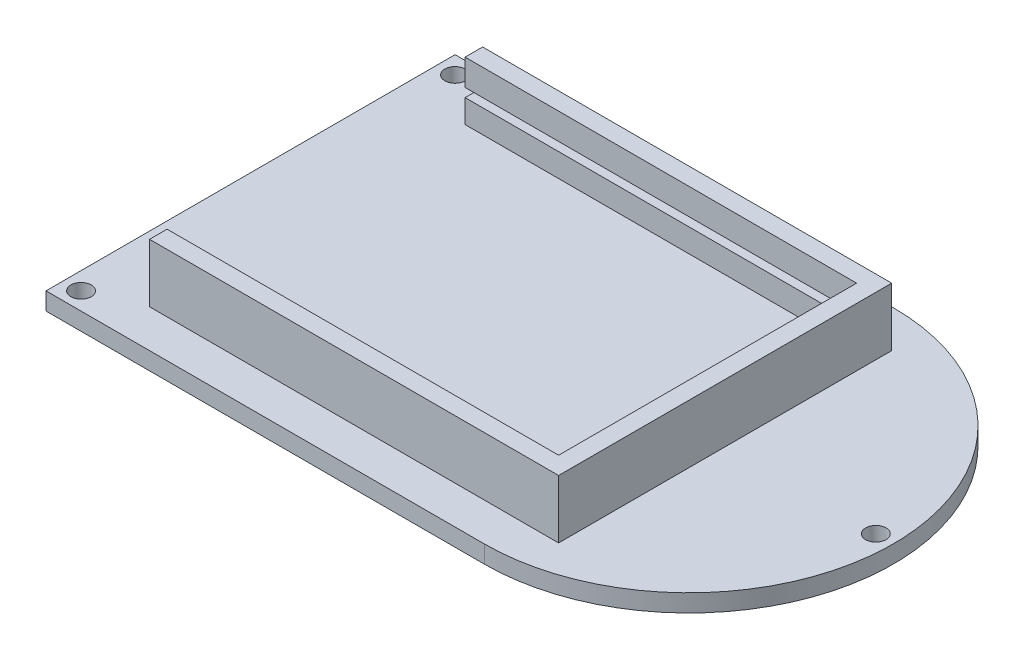
ISO-10303-21;
HEADER;
FILE_DESCRIPTION(('STEP AP214'),'2;1');
FILE_NAME('part.step','',(''),(''),'','','');
FILE_SCHEMA(('AUTOMOTIVE_DESIGN { 1 0 10303 214 1 1 1 1 }'));
ENDSEC;
DATA;
#1=APPLICATION_CONTEXT('core data for automotive mechanical design processes');
#2=APPLICATION_PROTOCOL_DEFINITION('international standard','automotive_design',2000,#1);
#3=PRODUCT_CONTEXT('',#1,'mechanical');
#4=PRODUCT('Part','Part','',(#3));
#5=PRODUCT_RELATED_PRODUCT_CATEGORY('part','',(#4));
#6=PRODUCT_DEFINITION_FORMATION('','',#4);
#7=PRODUCT_DEFINITION_CONTEXT('part definition',#1,'design');
#8=PRODUCT_DEFINITION('design','',#6,#7);
#9=PRODUCT_DEFINITION_SHAPE('','',#8);
#10=(LENGTH_UNIT() NAMED_UNIT(*) SI_UNIT(.MILLI.,.METRE.));
#11=(NAMED_UNIT(*) PLANE_ANGLE_UNIT() SI_UNIT($,.RADIAN.));
#12=(NAMED_UNIT(*) SI_UNIT($,.STERADIAN.) SOLID_ANGLE_UNIT());
#13=UNCERTAINTY_MEASURE_WITH_UNIT(LENGTH_MEASURE(1.E-05),#10,'distance_accuracy_value','');
#14=(GEOMETRIC_REPRESENTATION_CONTEXT(3) GLOBAL_UNCERTAINTY_ASSIGNED_CONTEXT((#13)) GLOBAL_UNIT_ASSIGNED_CONTEXT((#10,
#11,#12)) REPRESENTATION_CONTEXT('',''));
#15=CARTESIAN_POINT('',(0.,0.,0.));
#16=DIRECTION('',(0.,0.,1.));
#17=DIRECTION('',(1.,0.,0.));
#18=AXIS2_PLACEMENT_3D('',#15,#16,#17);
#19=CARTESIAN_POINT('',(-63.779471429519,13.,-25.5));
#20=DIRECTION('',(0.,0.,-1.));
#21=DIRECTION('',(-1.,0.,0.));
#22=AXIS2_PLACEMENT_3D('',#19,#20,#21);
#23=PLANE('',#22);
#24=DIRECTION('',(1.,0.,0.));
#25=VECTOR('',#24,1.);
#26=CARTESIAN_POINT('',(-63.779471429519,7.,-25.5));
#27=LINE('',#26,#25);
#28=CARTESIAN_POINT('',(-63.779471429519,7.,-25.5));
#29=VERTEX_POINT('',#28);
#30=CARTESIAN_POINT('',(3.22052857048104,7.,-25.5));
#31=VERTEX_POINT('',#30);
#32=EDGE_CURVE('E205',#29,#31,#27,.T.);
#33=ORIENTED_EDGE('',*,*,#32,.F.);
#34=DIRECTION('',(0.,-1.,0.));
#35=VECTOR('',#34,1.);
#36=CARTESIAN_POINT('',(-63.779471429519,13.,-25.5));
#37=LINE('',#36,#35);
#38=CARTESIAN_POINT('',(-63.779471429519,3.,-25.5));
#39=VERTEX_POINT('',#38);
#40=EDGE_CURVE('E269',#29,#39,#37,.T.);
#41=ORIENTED_EDGE('',*,*,#40,.T.);
#42=DIRECTION('',(1.,0.,0.));
#43=VECTOR('',#42,1.);
#44=CARTESIAN_POINT('',(-63.779471429519,3.,-25.5));
#45=LINE('',#44,#43);
#46=CARTESIAN_POINT('',(3.22052857048104,3.,-25.5));
#47=VERTEX_POINT('',#46);
#48=EDGE_CURVE('E253',#39,#47,#45,.T.);
#49=ORIENTED_EDGE('',*,*,#48,.T.);
#50=DIRECTION('',(0.,-1.,0.));
#51=VECTOR('',#50,1.);
#52=CARTESIAN_POINT('',(3.22052857048104,13.,-25.5));
#53=LINE('',#52,#51);
#54=EDGE_CURVE('E265',#31,#47,#53,.T.);
#55=ORIENTED_EDGE('',*,*,#54,.F.);
#56=EDGE_LOOP('',(#33,#41,#49,#55));
#57=FACE_BOUND('',#56,.T.);
#58=ADVANCED_FACE('F34',(#57),#23,.F.);
#59=CARTESIAN_POINT('',(3.22052857048104,13.,-25.5));
#60=DIRECTION('',(1.,0.,0.));
#61=DIRECTION('',(0.,0.,-1.));
#62=AXIS2_PLACEMENT_3D('',#59,#60,#61);
#63=PLANE('',#62);
#64=DIRECTION('',(0.,0.,1.));
#65=VECTOR('',#64,1.);
#66=CARTESIAN_POINT('',(3.22052857048104,7.,-25.5));
#67=LINE('',#66,#65);
#68=CARTESIAN_POINT('',(3.22052857048104,7.,25.5));
#69=VERTEX_POINT('',#68);
#70=EDGE_CURVE('E49',#31,#69,#67,.T.);
#71=ORIENTED_EDGE('',*,*,#70,.F.);
#72=ORIENTED_EDGE('',*,*,#54,.T.);
#73=DIRECTION('',(0.,0.,1.));
#74=VECTOR('',#73,1.);
#75=CARTESIAN_POINT('',(3.22052857048104,3.,-25.5));
#76=LINE('',#75,#74);
#77=CARTESIAN_POINT('',(3.22052857048104,3.,25.5));
#78=VERTEX_POINT('',#77);
#79=EDGE_CURVE('E256',#47,#78,#76,.T.);
#80=ORIENTED_EDGE('',*,*,#79,.T.);
#81=DIRECTION('',(0.,-1.,0.));
#82=VECTOR('',#81,1.);
#83=CARTESIAN_POINT('',(3.22052857048104,13.,25.5));
#84=LINE('',#83,#82);
#85=EDGE_CURVE('E56',#69,#78,#84,.T.);
#86=ORIENTED_EDGE('',*,*,#85,.F.);
#87=EDGE_LOOP('',(#71,#72,#80,#86));
#88=FACE_BOUND('',#87,.T.);
#89=ADVANCED_FACE('F352',(#88),#63,.F.);
#90=CARTESIAN_POINT('',(-63.779471429519,13.,25.5));
#91=DIRECTION('',(0.,0.,1.));
#92=DIRECTION('',(1.,0.,0.));
#93=AXIS2_PLACEMENT_3D('',#90,#91,#92);
#94=PLANE('',#93);
#95=DIRECTION('',(-1.,0.,0.));
#96=VECTOR('',#95,1.);
#97=CARTESIAN_POINT('',(-63.779471429519,7.,25.5));
#98=LINE('',#97,#96);
#99=CARTESIAN_POINT('',(-63.779471429519,7.,25.5));
#100=VERTEX_POINT('',#99);
#101=EDGE_CURVE('E332',#69,#100,#98,.T.);
#102=ORIENTED_EDGE('',*,*,#101,.F.);
#103=ORIENTED_EDGE('',*,*,#85,.T.);
#104=DIRECTION('',(-1.,0.,0.));
#105=VECTOR('',#104,1.);
#106=CARTESIAN_POINT('',(-63.779471429519,3.,25.5));
#107=LINE('',#106,#105);
#108=CARTESIAN_POINT('',(-63.779471429519,3.,25.5));
#109=VERTEX_POINT('',#108);
#110=EDGE_CURVE('E227',#78,#109,#107,.T.);
#111=ORIENTED_EDGE('',*,*,#110,.T.);
#112=DIRECTION('',(0.,-1.,0.));
#113=VECTOR('',#112,1.);
#114=CARTESIAN_POINT('',(-63.779471429519,13.,25.5));
#115=LINE('',#114,#113);
#116=EDGE_CURVE('E241',#100,#109,#115,.T.);
#117=ORIENTED_EDGE('',*,*,#116,.F.);
#118=EDGE_LOOP('',(#102,#103,#111,#117));
#119=FACE_BOUND('',#118,.T.);
#120=ADVANCED_FACE('F359',(#119),#94,.F.);
#121=CARTESIAN_POINT('',(0.,3.,0.));
#122=DIRECTION('',(0.,1.,0.));
#123=DIRECTION('',(0.,0.,1.));
#124=AXIS2_PLACEMENT_3D('',#121,#122,#123);
#125=PLANE('',#124);
#126=CARTESIAN_POINT('',(-72.,3.,32.));
#127=DIRECTION('',(0.,1.,0.));
#128=DIRECTION('',(0.,0.,1.));
#129=AXIS2_PLACEMENT_3D('',#126,#127,#128);
#130=CIRCLE('',#129,1.75);
#131=CARTESIAN_POINT('',(-72.,3.,33.75));
#132=VERTEX_POINT('',#131);
#133=EDGE_CURVE('E291',#132,#132,#130,.T.);
#134=ORIENTED_EDGE('',*,*,#133,.F.);
#135=EDGE_LOOP('',(#134));
#136=FACE_BOUND('',#135,.T.);
#137=CARTESIAN_POINT('',(0.,3.,0.));
#138=DIRECTION('',(0.,1.,0.));
#139=DIRECTION('',(0.,0.,1.));
#140=AXIS2_PLACEMENT_3D('',#137,#138,#139);
#141=CIRCLE('',#140,35.);
#142=CARTESIAN_POINT('',(0.,3.,35.));
#143=VERTEX_POINT('',#142);
#144=CARTESIAN_POINT('',(0.,3.,-35.));
#145=VERTEX_POINT('',#144);
#146=EDGE_CURVE('E303',#143,#145,#141,.T.);
#147=ORIENTED_EDGE('',*,*,#146,.T.);
#148=DIRECTION('',(-1.,0.,0.));
#149=VECTOR('',#148,1.);
#150=CARTESIAN_POINT('',(0.,3.,-35.));
#151=LINE('',#150,#149);
#152=CARTESIAN_POINT('',(-75.,3.,-35.));
#153=VERTEX_POINT('',#152);
#154=EDGE_CURVE('E306',#145,#153,#151,.T.);
#155=ORIENTED_EDGE('',*,*,#154,.T.);
#156=DIRECTION('',(0.,0.,1.));
#157=VECTOR('',#156,1.);
#158=CARTESIAN_POINT('',(-75.,3.,-35.));
#159=LINE('',#158,#157);
#160=CARTESIAN_POINT('',(-75.,3.,35.));
#161=VERTEX_POINT('',#160);
#162=EDGE_CURVE('E309',#153,#161,#159,.T.);
#163=ORIENTED_EDGE('',*,*,#162,.T.);
#164=DIRECTION('',(1.,0.,0.));
#165=VECTOR('',#164,1.);
#166=CARTESIAN_POINT('',(0.,3.,35.));
#167=LINE('',#166,#165);
#168=EDGE_CURVE('E311',#161,#143,#167,.T.);
#169=ORIENTED_EDGE('',*,*,#168,.T.);
#170=EDGE_LOOP('',(#147,#155,#163,#169));
#171=FACE_BOUND('',#170,.T.);
#172=CARTESIAN_POINT('',(-72.,3.,-32.));
#173=DIRECTION('',(0.,1.,0.));
#174=DIRECTION('',(0.,0.,1.));
#175=AXIS2_PLACEMENT_3D('',#172,#173,#174);
#176=CIRCLE('',#175,1.75);
#177=CARTESIAN_POINT('',(-72.,3.,-30.25));
#178=VERTEX_POINT('',#177);
#179=EDGE_CURVE('E297',#178,#178,#176,.T.);
#180=ORIENTED_EDGE('',*,*,#179,.F.);
#181=EDGE_LOOP('',(#180));
#182=FACE_BOUND('',#181,.T.);
#183=CARTESIAN_POINT('',(32.,3.,0.));
#184=DIRECTION('',(0.,1.,0.));
#185=DIRECTION('',(0.,0.,1.));
#186=AXIS2_PLACEMENT_3D('',#183,#184,#185);
#187=CIRCLE('',#186,1.75);
#188=CARTESIAN_POINT('',(32.,3.,1.75));
#189=VERTEX_POINT('',#188);
#190=EDGE_CURVE('E285',#189,#189,#187,.T.);
#191=ORIENTED_EDGE('',*,*,#190,.F.);
#192=EDGE_LOOP('',(#191));
#193=FACE_BOUND('',#192,.T.);
#194=DIRECTION('',(1.,0.,0.));
#195=VECTOR('',#194,1.);
#196=CARTESIAN_POINT('',(6.22052857048104,3.,28.5));
#197=LINE('',#196,#195);
#198=CARTESIAN_POINT('',(-63.779471429519,3.,28.5));
#199=VERTEX_POINT('',#198);
#200=CARTESIAN_POINT('',(6.22052857048104,3.,28.5));
#201=VERTEX_POINT('',#200);
#202=EDGE_CURVE('E244',#199,#201,#197,.T.);
#203=ORIENTED_EDGE('',*,*,#202,.F.);
#204=DIRECTION('',(0.,0.,1.));
#205=VECTOR('',#204,1.);
#206=CARTESIAN_POINT('',(-63.779471429519,3.,25.5));
#207=LINE('',#206,#205);
#208=EDGE_CURVE('E222',#109,#199,#207,.T.);
#209=ORIENTED_EDGE('',*,*,#208,.F.);
#210=ORIENTED_EDGE('',*,*,#110,.F.);
#211=ORIENTED_EDGE('',*,*,#79,.F.);
#212=ORIENTED_EDGE('',*,*,#48,.F.);
#213=DIRECTION('',(0.,0.,1.));
#214=VECTOR('',#213,1.);
#215=CARTESIAN_POINT('',(-63.779471429519,3.,-28.5));
#216=LINE('',#215,#214);
#217=CARTESIAN_POINT('',(-63.779471429519,3.,-28.5));
#218=VERTEX_POINT('',#217);
#219=EDGE_CURVE('E250',#218,#39,#216,.T.);
#220=ORIENTED_EDGE('',*,*,#219,.F.);
#221=DIRECTION('',(-1.,0.,0.));
#222=VECTOR('',#221,1.);
#223=CARTESIAN_POINT('',(6.22052857048103,3.,-28.5));
#224=LINE('',#223,#222);
#225=CARTESIAN_POINT('',(6.22052857048103,3.,-28.5));
#226=VERTEX_POINT('',#225);
#227=EDGE_CURVE('E248',#226,#218,#224,.T.);
#228=ORIENTED_EDGE('',*,*,#227,.F.);
#229=DIRECTION('',(0.,0.,-1.));
#230=VECTOR('',#229,1.);
#231=CARTESIAN_POINT('',(6.22052857048103,3.,-28.5));
#232=LINE('',#231,#230);
#233=EDGE_CURVE('E246',#201,#226,#232,.T.);
#234=ORIENTED_EDGE('',*,*,#233,.F.);
#235=EDGE_LOOP('',(#203,#209,#210,#211,#212,#220,#228,#234));
#236=FACE_BOUND('',#235,.T.);
#237=ADVANCED_FACE('F357',(#136,#171,#182,#193,#236),#125,.T.);
#238=CARTESIAN_POINT('',(0.,0.,0.));
#239=DIRECTION('',(0.,1.,0.));
#240=DIRECTION('',(0.,0.,1.));
#241=AXIS2_PLACEMENT_3D('',#238,#239,#240);
#242=PLANE('',#241);
#243=CARTESIAN_POINT('',(0.,0.,0.));
#244=DIRECTION('',(0.,1.,0.));
#245=DIRECTION('',(0.,0.,1.));
#246=AXIS2_PLACEMENT_3D('',#243,#244,#245);
#247=CIRCLE('',#246,35.);
#248=CARTESIAN_POINT('',(0.,0.,35.));
#249=VERTEX_POINT('',#248);
#250=CARTESIAN_POINT('',(0.,0.,-35.));
#251=VERTEX_POINT('',#250);
#252=EDGE_CURVE('E300',#249,#251,#247,.T.);
#253=ORIENTED_EDGE('',*,*,#252,.F.);
#254=DIRECTION('',(1.,0.,0.));
#255=VECTOR('',#254,1.);
#256=CARTESIAN_POINT('',(0.,0.,35.));
#257=LINE('',#256,#255);
#258=CARTESIAN_POINT('',(-75.,0.,35.));
#259=VERTEX_POINT('',#258);
#260=EDGE_CURVE('E307',#259,#249,#257,.T.);
#261=ORIENTED_EDGE('',*,*,#260,.F.);
#262=DIRECTION('',(0.,0.,1.));
#263=VECTOR('',#262,1.);
#264=CARTESIAN_POINT('',(-75.,0.,-35.));
#265=LINE('',#264,#263);
#266=CARTESIAN_POINT('',(-75.,0.,-35.));
#267=VERTEX_POINT('',#266);
#268=EDGE_CURVE('E318',#267,#259,#265,.T.);
#269=ORIENTED_EDGE('',*,*,#268,.F.);
#270=DIRECTION('',(-1.,0.,0.));
#271=VECTOR('',#270,1.);
#272=CARTESIAN_POINT('',(0.,0.,-35.));
#273=LINE('',#272,#271);
#274=EDGE_CURVE('E316',#251,#267,#273,.T.);
#275=ORIENTED_EDGE('',*,*,#274,.F.);
#276=EDGE_LOOP('',(#253,#261,#269,#275));
#277=FACE_BOUND('',#276,.T.);
#278=CARTESIAN_POINT('',(-72.,0.,-32.));
#279=DIRECTION('',(0.,1.,0.));
#280=DIRECTION('',(0.,0.,1.));
#281=AXIS2_PLACEMENT_3D('',#278,#279,#280);
#282=CIRCLE('',#281,1.75);
#283=CARTESIAN_POINT('',(-72.,0.,-30.25));
#284=VERTEX_POINT('',#283);
#285=EDGE_CURVE('E294',#284,#284,#282,.T.);
#286=ORIENTED_EDGE('',*,*,#285,.T.);
#287=EDGE_LOOP('',(#286));
#288=FACE_BOUND('',#287,.T.);
#289=CARTESIAN_POINT('',(-72.,0.,32.));
#290=DIRECTION('',(0.,1.,0.));
#291=DIRECTION('',(0.,0.,1.));
#292=AXIS2_PLACEMENT_3D('',#289,#290,#291);
#293=CIRCLE('',#292,1.75);
#294=CARTESIAN_POINT('',(-72.,0.,33.75));
#295=VERTEX_POINT('',#294);
#296=EDGE_CURVE('E288',#295,#295,#293,.T.);
#297=ORIENTED_EDGE('',*,*,#296,.T.);
#298=EDGE_LOOP('',(#297));
#299=FACE_BOUND('',#298,.T.);
#300=CARTESIAN_POINT('',(32.,0.,0.));
#301=DIRECTION('',(0.,1.,0.));
#302=DIRECTION('',(0.,0.,1.));
#303=AXIS2_PLACEMENT_3D('',#300,#301,#302);
#304=CIRCLE('',#303,1.75);
#305=CARTESIAN_POINT('',(32.,0.,1.75));
#306=VERTEX_POINT('',#305);
#307=EDGE_CURVE('E284',#306,#306,#304,.T.);
#308=ORIENTED_EDGE('',*,*,#307,.T.);
#309=EDGE_LOOP('',(#308));
#310=FACE_BOUND('',#309,.T.);
#311=ADVANCED_FACE('F440',(#277,#288,#299,#310),#242,.F.);
#312=CARTESIAN_POINT('',(0.,3.,0.));
#313=DIRECTION('',(0.,-1.,0.));
#314=DIRECTION('',(0.,0.,-1.));
#315=AXIS2_PLACEMENT_3D('',#312,#313,#314);
#316=CYLINDRICAL_SURFACE('',#315,35.);
#317=ORIENTED_EDGE('',*,*,#252,.T.);
#318=DIRECTION('',(0.,-1.,0.));
#319=VECTOR('',#318,1.);
#320=CARTESIAN_POINT('',(0.,3.,-35.));
#321=LINE('',#320,#319);
#322=EDGE_CURVE('E329',#145,#251,#321,.T.);
#323=ORIENTED_EDGE('',*,*,#322,.F.);
#324=ORIENTED_EDGE('',*,*,#146,.F.);
#325=DIRECTION('',(0.,-1.,0.));
#326=VECTOR('',#325,1.);
#327=CARTESIAN_POINT('',(0.,3.,35.));
#328=LINE('',#327,#326);
#329=EDGE_CURVE('E313',#143,#249,#328,.T.);
#330=ORIENTED_EDGE('',*,*,#329,.T.);
#331=EDGE_LOOP('',(#317,#323,#324,#330));
#332=FACE_BOUND('',#331,.T.);
#333=ADVANCED_FACE('F36',(#332),#316,.T.);
#334=CARTESIAN_POINT('',(0.,3.,-35.));
#335=DIRECTION('',(0.,0.,1.));
#336=DIRECTION('',(1.,0.,0.));
#337=AXIS2_PLACEMENT_3D('',#334,#335,#336);
#338=PLANE('',#337);
#339=ORIENTED_EDGE('',*,*,#274,.T.);
#340=DIRECTION('',(0.,-1.,0.));
#341=VECTOR('',#340,1.);
#342=CARTESIAN_POINT('',(-75.,3.,-35.));
#343=LINE('',#342,#341);
#344=EDGE_CURVE('E326',#153,#267,#343,.T.);
#345=ORIENTED_EDGE('',*,*,#344,.F.);
#346=ORIENTED_EDGE('',*,*,#154,.F.);
#347=ORIENTED_EDGE('',*,*,#322,.T.);
#348=EDGE_LOOP('',(#339,#345,#346,#347));
#349=FACE_BOUND('',#348,.T.);
#350=ADVANCED_FACE('F492',(#349),#338,.F.);
#351=CARTESIAN_POINT('',(-75.,3.,-35.));
#352=DIRECTION('',(1.,0.,0.));
#353=DIRECTION('',(0.,0.,-1.));
#354=AXIS2_PLACEMENT_3D('',#351,#352,#353);
#355=PLANE('',#354);
#356=ORIENTED_EDGE('',*,*,#268,.T.);
#357=DIRECTION('',(0.,-1.,0.));
#358=VECTOR('',#357,1.);
#359=CARTESIAN_POINT('',(-75.,3.,35.));
#360=LINE('',#359,#358);
#361=EDGE_CURVE('E323',#161,#259,#360,.T.);
#362=ORIENTED_EDGE('',*,*,#361,.F.);
#363=ORIENTED_EDGE('',*,*,#162,.F.);
#364=ORIENTED_EDGE('',*,*,#344,.T.);
#365=EDGE_LOOP('',(#356,#362,#363,#364));
#366=FACE_BOUND('',#365,.T.);
#367=ADVANCED_FACE('F482',(#366),#355,.F.);
#368=CARTESIAN_POINT('',(0.,3.,35.));
#369=DIRECTION('',(0.,0.,-1.));
#370=DIRECTION('',(-1.,0.,0.));
#371=AXIS2_PLACEMENT_3D('',#368,#369,#370);
#372=PLANE('',#371);
#373=ORIENTED_EDGE('',*,*,#260,.T.);
#374=ORIENTED_EDGE('',*,*,#329,.F.);
#375=ORIENTED_EDGE('',*,*,#168,.F.);
#376=ORIENTED_EDGE('',*,*,#361,.T.);
#377=EDGE_LOOP('',(#373,#374,#375,#376));
#378=FACE_BOUND('',#377,.T.);
#379=ADVANCED_FACE('F472',(#378),#372,.F.);
#380=CARTESIAN_POINT('',(-72.,3.,-32.));
#381=DIRECTION('',(0.,-1.,0.));
#382=DIRECTION('',(0.,0.,-1.));
#383=AXIS2_PLACEMENT_3D('',#380,#381,#382);
#384=CYLINDRICAL_SURFACE('',#383,1.75);
#385=ORIENTED_EDGE('',*,*,#179,.T.);
#386=EDGE_LOOP('',(#385));
#387=FACE_BOUND('',#386,.T.);
#388=ORIENTED_EDGE('',*,*,#285,.F.);
#389=EDGE_LOOP('',(#388));
#390=FACE_BOUND('',#389,.T.);
#391=ADVANCED_FACE('F462',(#387,#390),#384,.F.);
#392=CARTESIAN_POINT('',(-72.,3.,32.));
#393=DIRECTION('',(0.,-1.,0.));
#394=DIRECTION('',(0.,0.,-1.));
#395=AXIS2_PLACEMENT_3D('',#392,#393,#394);
#396=CYLINDRICAL_SURFACE('',#395,1.75);
#397=ORIENTED_EDGE('',*,*,#133,.T.);
#398=EDGE_LOOP('',(#397));
#399=FACE_BOUND('',#398,.T.);
#400=ORIENTED_EDGE('',*,*,#296,.F.);
#401=EDGE_LOOP('',(#400));
#402=FACE_BOUND('',#401,.T.);
#403=ADVANCED_FACE('F452',(#399,#402),#396,.F.);
#404=CARTESIAN_POINT('',(32.,3.,0.));
#405=DIRECTION('',(0.,-1.,0.));
#406=DIRECTION('',(0.,0.,-1.));
#407=AXIS2_PLACEMENT_3D('',#404,#405,#406);
#408=CYLINDRICAL_SURFACE('',#407,1.75);
#409=ORIENTED_EDGE('',*,*,#190,.T.);
#410=EDGE_LOOP('',(#409));
#411=FACE_BOUND('',#410,.T.);
#412=ORIENTED_EDGE('',*,*,#307,.F.);
#413=EDGE_LOOP('',(#412));
#414=FACE_BOUND('',#413,.T.);
#415=ADVANCED_FACE('F401',(#411,#414),#408,.F.);
#416=CARTESIAN_POINT('',(-63.779471429519,13.,25.5));
#417=DIRECTION('',(1.,0.,0.));
#418=DIRECTION('',(0.,0.,-1.));
#419=AXIS2_PLACEMENT_3D('',#416,#417,#418);
#420=PLANE('',#419);
#421=CARTESIAN_POINT('',(-63.779471429519,13.,25.5));
#422=VERTEX_POINT('',#421);
#423=CARTESIAN_POINT('',(-63.779471429519,8.5,25.5));
#424=VERTEX_POINT('',#423);
#425=EDGE_CURVE('E259',#422,#424,#115,.T.);
#426=ORIENTED_EDGE('',*,*,#425,.T.);
#427=DIRECTION('',(0.,0.,1.));
#428=VECTOR('',#427,1.);
#429=CARTESIAN_POINT('',(-63.779471429519,8.5,25.5));
#430=LINE('',#429,#428);
#431=CARTESIAN_POINT('',(-63.779471429519,8.5,27.));
#432=VERTEX_POINT('',#431);
#433=EDGE_CURVE('E220',#424,#432,#430,.T.);
#434=ORIENTED_EDGE('',*,*,#433,.T.);
#435=DIRECTION('',(0.,1.,0.));
#436=VECTOR('',#435,1.);
#437=CARTESIAN_POINT('',(-63.779471429519,13.,27.));
#438=LINE('',#437,#436);
#439=CARTESIAN_POINT('',(-63.779471429519,7.,27.));
#440=VERTEX_POINT('',#439);
#441=EDGE_CURVE('E11',#440,#432,#438,.T.);
#442=ORIENTED_EDGE('',*,*,#441,.F.);
#443=DIRECTION('',(0.,0.,1.));
#444=VECTOR('',#443,1.);
#445=CARTESIAN_POINT('',(-63.779471429519,7.,25.5));
#446=LINE('',#445,#444);
#447=EDGE_CURVE('E209',#100,#440,#446,.T.);
#448=ORIENTED_EDGE('',*,*,#447,.F.);
#449=ORIENTED_EDGE('',*,*,#116,.T.);
#450=ORIENTED_EDGE('',*,*,#208,.T.);
#451=DIRECTION('',(0.,-1.,0.));
#452=VECTOR('',#451,1.);
#453=CARTESIAN_POINT('',(-63.779471429519,13.,28.5));
#454=LINE('',#453,#452);
#455=CARTESIAN_POINT('',(-63.779471429519,13.,28.5));
#456=VERTEX_POINT('',#455);
#457=EDGE_CURVE('E282',#456,#199,#454,.T.);
#458=ORIENTED_EDGE('',*,*,#457,.F.);
#459=DIRECTION('',(0.,0.,1.));
#460=VECTOR('',#459,1.);
#461=CARTESIAN_POINT('',(-63.779471429519,13.,25.5));
#462=LINE('',#461,#460);
#463=EDGE_CURVE('E223',#422,#456,#462,.T.);
#464=ORIENTED_EDGE('',*,*,#463,.F.);
#465=EDGE_LOOP('',(#426,#434,#442,#448,#449,#450,#458,#464));
#466=FACE_BOUND('',#465,.T.);
#467=ADVANCED_FACE('F362',(#466),#420,.F.);
#468=CARTESIAN_POINT('',(6.22052857048104,13.,28.5));
#469=DIRECTION('',(0.,0.,-1.));
#470=DIRECTION('',(-1.,0.,0.));
#471=AXIS2_PLACEMENT_3D('',#468,#469,#470);
#472=PLANE('',#471);
#473=ORIENTED_EDGE('',*,*,#202,.T.);
#474=DIRECTION('',(0.,-1.,0.));
#475=VECTOR('',#474,1.);
#476=CARTESIAN_POINT('',(6.22052857048104,13.,28.5));
#477=LINE('',#476,#475);
#478=CARTESIAN_POINT('',(6.22052857048104,13.,28.5));
#479=VERTEX_POINT('',#478);
#480=EDGE_CURVE('E279',#479,#201,#477,.T.);
#481=ORIENTED_EDGE('',*,*,#480,.F.);
#482=DIRECTION('',(1.,0.,0.));
#483=VECTOR('',#482,1.);
#484=CARTESIAN_POINT('',(6.22052857048104,13.,28.5));
#485=LINE('',#484,#483);
#486=EDGE_CURVE('E226',#456,#479,#485,.T.);
#487=ORIENTED_EDGE('',*,*,#486,.F.);
#488=ORIENTED_EDGE('',*,*,#457,.T.);
#489=EDGE_LOOP('',(#473,#481,#487,#488));
#490=FACE_BOUND('',#489,.T.);
#491=ADVANCED_FACE('F393',(#490),#472,.F.);
#492=CARTESIAN_POINT('',(6.22052857048103,13.,-28.5));
#493=DIRECTION('',(-1.,0.,0.));
#494=DIRECTION('',(0.,0.,1.));
#495=AXIS2_PLACEMENT_3D('',#492,#493,#494);
#496=PLANE('',#495);
#497=ORIENTED_EDGE('',*,*,#233,.T.);
#498=DIRECTION('',(0.,-1.,0.));
#499=VECTOR('',#498,1.);
#500=CARTESIAN_POINT('',(6.22052857048103,13.,-28.5));
#501=LINE('',#500,#499);
#502=CARTESIAN_POINT('',(6.22052857048103,13.,-28.5));
#503=VERTEX_POINT('',#502);
#504=EDGE_CURVE('E276',#503,#226,#501,.T.);
#505=ORIENTED_EDGE('',*,*,#504,.F.);
#506=DIRECTION('',(0.,0.,-1.));
#507=VECTOR('',#506,1.);
#508=CARTESIAN_POINT('',(6.22052857048103,13.,-28.5));
#509=LINE('',#508,#507);
#510=EDGE_CURVE('E229',#479,#503,#509,.T.);
#511=ORIENTED_EDGE('',*,*,#510,.F.);
#512=ORIENTED_EDGE('',*,*,#480,.T.);
#513=EDGE_LOOP('',(#497,#505,#511,#512));
#514=FACE_BOUND('',#513,.T.);
#515=ADVANCED_FACE('F390',(#514),#496,.F.);
#516=CARTESIAN_POINT('',(6.22052857048103,13.,-28.5));
#517=DIRECTION('',(0.,0.,1.));
#518=DIRECTION('',(1.,0.,0.));
#519=AXIS2_PLACEMENT_3D('',#516,#517,#518);
#520=PLANE('',#519);
#521=ORIENTED_EDGE('',*,*,#227,.T.);
#522=DIRECTION('',(0.,-1.,0.));
#523=VECTOR('',#522,1.);
#524=CARTESIAN_POINT('',(-63.779471429519,13.,-28.5));
#525=LINE('',#524,#523);
#526=CARTESIAN_POINT('',(-63.779471429519,13.,-28.5));
#527=VERTEX_POINT('',#526);
#528=EDGE_CURVE('E273',#527,#218,#525,.T.);
#529=ORIENTED_EDGE('',*,*,#528,.F.);
#530=DIRECTION('',(-1.,0.,0.));
#531=VECTOR('',#530,1.);
#532=CARTESIAN_POINT('',(6.22052857048103,13.,-28.5));
#533=LINE('',#532,#531);
#534=EDGE_CURVE('E231',#503,#527,#533,.T.);
#535=ORIENTED_EDGE('',*,*,#534,.F.);
#536=ORIENTED_EDGE('',*,*,#504,.T.);
#537=EDGE_LOOP('',(#521,#529,#535,#536));
#538=FACE_BOUND('',#537,.T.);
#539=ADVANCED_FACE('F386',(#538),#520,.F.);
#540=CARTESIAN_POINT('',(-63.779471429519,13.,-28.5));
#541=DIRECTION('',(1.,0.,0.));
#542=DIRECTION('',(0.,0.,-1.));
#543=AXIS2_PLACEMENT_3D('',#540,#541,#542);
#544=PLANE('',#543);
#545=DIRECTION('',(0.,-1.,0.));
#546=VECTOR('',#545,1.);
#547=CARTESIAN_POINT('',(-63.779471429519,13.,-27.));
#548=LINE('',#547,#546);
#549=CARTESIAN_POINT('',(-63.779471429519,8.5,-27.));
#550=VERTEX_POINT('',#549);
#551=CARTESIAN_POINT('',(-63.779471429519,7.,-27.));
#552=VERTEX_POINT('',#551);
#553=EDGE_CURVE('E42',#550,#552,#548,.T.);
#554=ORIENTED_EDGE('',*,*,#553,.F.);
#555=DIRECTION('',(0.,0.,1.));
#556=VECTOR('',#555,1.);
#557=CARTESIAN_POINT('',(-63.779471429519,8.5,-28.5));
#558=LINE('',#557,#556);
#559=CARTESIAN_POINT('',(-63.779471429519,8.5,-25.5));
#560=VERTEX_POINT('',#559);
#561=EDGE_CURVE('E217',#550,#560,#558,.T.);
#562=ORIENTED_EDGE('',*,*,#561,.T.);
#563=CARTESIAN_POINT('',(-63.779471429519,13.,-25.5));
#564=VERTEX_POINT('',#563);
#565=EDGE_CURVE('E270',#564,#560,#37,.T.);
#566=ORIENTED_EDGE('',*,*,#565,.F.);
#567=DIRECTION('',(0.,0.,1.));
#568=VECTOR('',#567,1.);
#569=CARTESIAN_POINT('',(-63.779471429519,13.,-28.5));
#570=LINE('',#569,#568);
#571=EDGE_CURVE('E233',#527,#564,#570,.T.);
#572=ORIENTED_EDGE('',*,*,#571,.F.);
#573=ORIENTED_EDGE('',*,*,#528,.T.);
#574=ORIENTED_EDGE('',*,*,#219,.T.);
#575=ORIENTED_EDGE('',*,*,#40,.F.);
#576=DIRECTION('',(0.,0.,1.));
#577=VECTOR('',#576,1.);
#578=CARTESIAN_POINT('',(-63.779471429519,7.,-28.5));
#579=LINE('',#578,#577);
#580=EDGE_CURVE('E207',#552,#29,#579,.T.);
#581=ORIENTED_EDGE('',*,*,#580,.F.);
#582=EDGE_LOOP('',(#554,#562,#566,#572,#573,#574,#575,#581));
#583=FACE_BOUND('',#582,.T.);
#584=ADVANCED_FACE('F345',(#583),#544,.F.);
#585=ORIENTED_EDGE('',*,*,#565,.T.);
#586=DIRECTION('',(1.,0.,0.));
#587=VECTOR('',#586,1.);
#588=CARTESIAN_POINT('',(-63.779471429519,8.5,-25.5));
#589=LINE('',#588,#587);
#590=CARTESIAN_POINT('',(3.22052857048104,8.5,-25.5));
#591=VERTEX_POINT('',#590);
#592=EDGE_CURVE('E214',#560,#591,#589,.T.);
#593=ORIENTED_EDGE('',*,*,#592,.T.);
#594=CARTESIAN_POINT('',(3.22052857048104,13.,-25.5));
#595=VERTEX_POINT('',#594);
#596=EDGE_CURVE('E266',#595,#591,#53,.T.);
#597=ORIENTED_EDGE('',*,*,#596,.F.);
#598=DIRECTION('',(1.,0.,0.));
#599=VECTOR('',#598,1.);
#600=CARTESIAN_POINT('',(-63.779471429519,13.,-25.5));
#601=LINE('',#600,#599);
#602=EDGE_CURVE('E235',#564,#595,#601,.T.);
#603=ORIENTED_EDGE('',*,*,#602,.F.);
#604=EDGE_LOOP('',(#585,#593,#597,#603));
#605=FACE_BOUND('',#604,.T.);
#606=ADVANCED_FACE('F375',(#605),#23,.F.);
#607=ORIENTED_EDGE('',*,*,#596,.T.);
#608=DIRECTION('',(0.,0.,1.));
#609=VECTOR('',#608,1.);
#610=CARTESIAN_POINT('',(3.22052857048104,8.5,-25.5));
#611=LINE('',#610,#609);
#612=CARTESIAN_POINT('',(3.22052857048104,8.5,25.5));
#613=VERTEX_POINT('',#612);
#614=EDGE_CURVE('E211',#591,#613,#611,.T.);
#615=ORIENTED_EDGE('',*,*,#614,.T.);
#616=CARTESIAN_POINT('',(3.22052857048104,13.,25.5));
#617=VERTEX_POINT('',#616);
#618=EDGE_CURVE('E262',#617,#613,#84,.T.);
#619=ORIENTED_EDGE('',*,*,#618,.F.);
#620=DIRECTION('',(0.,0.,1.));
#621=VECTOR('',#620,1.);
#622=CARTESIAN_POINT('',(3.22052857048104,13.,-25.5));
#623=LINE('',#622,#621);
#624=EDGE_CURVE('E237',#595,#617,#623,.T.);
#625=ORIENTED_EDGE('',*,*,#624,.F.);
#626=EDGE_LOOP('',(#607,#615,#619,#625));
#627=FACE_BOUND('',#626,.T.);
#628=ADVANCED_FACE('F372',(#627),#63,.F.);
#629=ORIENTED_EDGE('',*,*,#618,.T.);
#630=DIRECTION('',(-1.,0.,0.));
#631=VECTOR('',#630,1.);
#632=CARTESIAN_POINT('',(-63.779471429519,8.5,25.5));
#633=LINE('',#632,#631);
#634=EDGE_CURVE('E334',#613,#424,#633,.T.);
#635=ORIENTED_EDGE('',*,*,#634,.T.);
#636=ORIENTED_EDGE('',*,*,#425,.F.);
#637=DIRECTION('',(-1.,0.,0.));
#638=VECTOR('',#637,1.);
#639=CARTESIAN_POINT('',(-63.779471429519,13.,25.5));
#640=LINE('',#639,#638);
#641=EDGE_CURVE('E239',#617,#422,#640,.T.);
#642=ORIENTED_EDGE('',*,*,#641,.F.);
#643=EDGE_LOOP('',(#629,#635,#636,#642));
#644=FACE_BOUND('',#643,.T.);
#645=ADVANCED_FACE('F367',(#644),#94,.F.);
#646=CARTESIAN_POINT('',(0.,13.,0.));
#647=DIRECTION('',(0.,-1.,0.));
#648=DIRECTION('',(0.,0.,-1.));
#649=AXIS2_PLACEMENT_3D('',#646,#647,#648);
#650=PLANE('',#649);
#651=ORIENTED_EDGE('',*,*,#463,.T.);
#652=ORIENTED_EDGE('',*,*,#486,.T.);
#653=ORIENTED_EDGE('',*,*,#510,.T.);
#654=ORIENTED_EDGE('',*,*,#534,.T.);
#655=ORIENTED_EDGE('',*,*,#571,.T.);
#656=ORIENTED_EDGE('',*,*,#602,.T.);
#657=ORIENTED_EDGE('',*,*,#624,.T.);
#658=ORIENTED_EDGE('',*,*,#641,.T.);
#659=EDGE_LOOP('',(#651,#652,#653,#654,#655,#656,#657,#658));
#660=FACE_BOUND('',#659,.T.);
#661=ADVANCED_FACE('F381',(#660),#650,.F.);
#662=CARTESIAN_POINT('',(-65.9615354916861,8.5,27.));
#663=DIRECTION('',(0.,0.,-1.));
#664=DIRECTION('',(-1.,0.,0.));
#665=AXIS2_PLACEMENT_3D('',#662,#663,#664);
#666=PLANE('',#665);
#667=ORIENTED_EDGE('',*,*,#441,.T.);
#668=DIRECTION('',(1.,0.,0.));
#669=VECTOR('',#668,1.);
#670=CARTESIAN_POINT('',(-65.9615354916861,8.5,27.));
#671=LINE('',#670,#669);
#672=CARTESIAN_POINT('',(4.72052857048104,8.5,27.));
#673=VERTEX_POINT('',#672);
#674=EDGE_CURVE('E171',#432,#673,#671,.T.);
#675=ORIENTED_EDGE('',*,*,#674,.T.);
#676=DIRECTION('',(0.,-1.,0.));
#677=VECTOR('',#676,1.);
#678=CARTESIAN_POINT('',(4.72052857048104,8.5,27.));
#679=LINE('',#678,#677);
#680=CARTESIAN_POINT('',(4.72052857048104,7.,27.));
#681=VERTEX_POINT('',#680);
#682=EDGE_CURVE('E175',#673,#681,#679,.T.);
#683=ORIENTED_EDGE('',*,*,#682,.T.);
#684=DIRECTION('',(1.,0.,0.));
#685=VECTOR('',#684,1.);
#686=CARTESIAN_POINT('',(-65.9615354916861,7.,27.));
#687=LINE('',#686,#685);
#688=EDGE_CURVE('E198',#440,#681,#687,.T.);
#689=ORIENTED_EDGE('',*,*,#688,.F.);
#690=EDGE_LOOP('',(#667,#675,#683,#689));
#691=FACE_BOUND('',#690,.T.);
#692=ADVANCED_FACE('F173',(#691),#666,.T.);
#693=CARTESIAN_POINT('',(-65.9615354916861,8.5,-27.));
#694=DIRECTION('',(0.,0.,1.));
#695=DIRECTION('',(1.,0.,0.));
#696=AXIS2_PLACEMENT_3D('',#693,#694,#695);
#697=PLANE('',#696);
#698=ORIENTED_EDGE('',*,*,#553,.T.);
#699=DIRECTION('',(-1.,0.,0.));
#700=VECTOR('',#699,1.);
#701=CARTESIAN_POINT('',(-65.9615354916861,7.,-27.));
#702=LINE('',#701,#700);
#703=CARTESIAN_POINT('',(4.72052857048104,7.,-27.));
#704=VERTEX_POINT('',#703);
#705=EDGE_CURVE('E182',#704,#552,#702,.T.);
#706=ORIENTED_EDGE('',*,*,#705,.F.);
#707=DIRECTION('',(0.,-1.,0.));
#708=VECTOR('',#707,1.);
#709=CARTESIAN_POINT('',(4.72052857048104,8.5,-27.));
#710=LINE('',#709,#708);
#711=CARTESIAN_POINT('',(4.72052857048104,8.5,-27.));
#712=VERTEX_POINT('',#711);
#713=EDGE_CURVE('E189',#712,#704,#710,.T.);
#714=ORIENTED_EDGE('',*,*,#713,.F.);
#715=DIRECTION('',(-1.,0.,0.));
#716=VECTOR('',#715,1.);
#717=CARTESIAN_POINT('',(-65.9615354916861,8.5,-27.));
#718=LINE('',#717,#716);
#719=EDGE_CURVE('E194',#712,#550,#718,.T.);
#720=ORIENTED_EDGE('',*,*,#719,.T.);
#721=EDGE_LOOP('',(#698,#706,#714,#720));
#722=FACE_BOUND('',#721,.T.);
#723=ADVANCED_FACE('F339',(#722),#697,.T.);
#724=CARTESIAN_POINT('',(0.,8.5,0.));
#725=DIRECTION('',(0.,1.,0.));
#726=DIRECTION('',(0.,0.,1.));
#727=AXIS2_PLACEMENT_3D('',#724,#725,#726);
#728=PLANE('',#727);
#729=ORIENTED_EDGE('',*,*,#634,.F.);
#730=ORIENTED_EDGE('',*,*,#614,.F.);
#731=ORIENTED_EDGE('',*,*,#592,.F.);
#732=ORIENTED_EDGE('',*,*,#561,.F.);
#733=ORIENTED_EDGE('',*,*,#719,.F.);
#734=DIRECTION('',(0.,0.,-1.));
#735=VECTOR('',#734,1.);
#736=CARTESIAN_POINT('',(4.72052857048104,8.5,-27.));
#737=LINE('',#736,#735);
#738=EDGE_CURVE('E181',#673,#712,#737,.T.);
#739=ORIENTED_EDGE('',*,*,#738,.F.);
#740=ORIENTED_EDGE('',*,*,#674,.F.);
#741=ORIENTED_EDGE('',*,*,#433,.F.);
#742=EDGE_LOOP('',(#729,#730,#731,#732,#733,#739,#740,#741));
#743=FACE_BOUND('',#742,.T.);
#744=ADVANCED_FACE('F192',(#743),#728,.F.);
#745=CARTESIAN_POINT('',(0.,7.,0.));
#746=DIRECTION('',(0.,1.,0.));
#747=DIRECTION('',(0.,0.,1.));
#748=AXIS2_PLACEMENT_3D('',#745,#746,#747);
#749=PLANE('',#748);
#750=ORIENTED_EDGE('',*,*,#447,.T.);
#751=ORIENTED_EDGE('',*,*,#688,.T.);
#752=DIRECTION('',(0.,0.,-1.));
#753=VECTOR('',#752,1.);
#754=CARTESIAN_POINT('',(4.72052857048104,7.,-27.));
#755=LINE('',#754,#753);
#756=EDGE_CURVE('E188',#681,#704,#755,.T.);
#757=ORIENTED_EDGE('',*,*,#756,.T.);
#758=ORIENTED_EDGE('',*,*,#705,.T.);
#759=ORIENTED_EDGE('',*,*,#580,.T.);
#760=ORIENTED_EDGE('',*,*,#32,.T.);
#761=ORIENTED_EDGE('',*,*,#70,.T.);
#762=ORIENTED_EDGE('',*,*,#101,.T.);
#763=EDGE_LOOP('',(#750,#751,#757,#758,#759,#760,#761,#762));
#764=FACE_BOUND('',#763,.T.);
#765=ADVANCED_FACE('F342',(#764),#749,.T.);
#766=CARTESIAN_POINT('',(4.72052857048104,8.5,-27.));
#767=DIRECTION('',(-1.,0.,0.));
#768=DIRECTION('',(0.,0.,1.));
#769=AXIS2_PLACEMENT_3D('',#766,#767,#768);
#770=PLANE('',#769);
#771=ORIENTED_EDGE('',*,*,#756,.F.);
#772=ORIENTED_EDGE('',*,*,#682,.F.);
#773=ORIENTED_EDGE('',*,*,#738,.T.);
#774=ORIENTED_EDGE('',*,*,#713,.T.);
#775=EDGE_LOOP('',(#771,#772,#773,#774));
#776=FACE_BOUND('',#775,.T.);
#777=ADVANCED_FACE('F185',(#776),#770,.T.);
#778=CLOSED_SHELL('',(#58,#89,#120,#237,#311,#333,#350,#367,#379,#391,#403,#415,#467,#491,#515,
#539,#584,#606,#628,#645,#661,#692,#723,#744,#765,#777));
#779=MANIFOLD_SOLID_BREP('B2',#778);
#780=ADVANCED_BREP_SHAPE_REPRESENTATION('',(#18,#779),#14);
#781=SHAPE_DEFINITION_REPRESENTATION(#9,#780);
ENDSEC;
END-ISO-10303-21;
